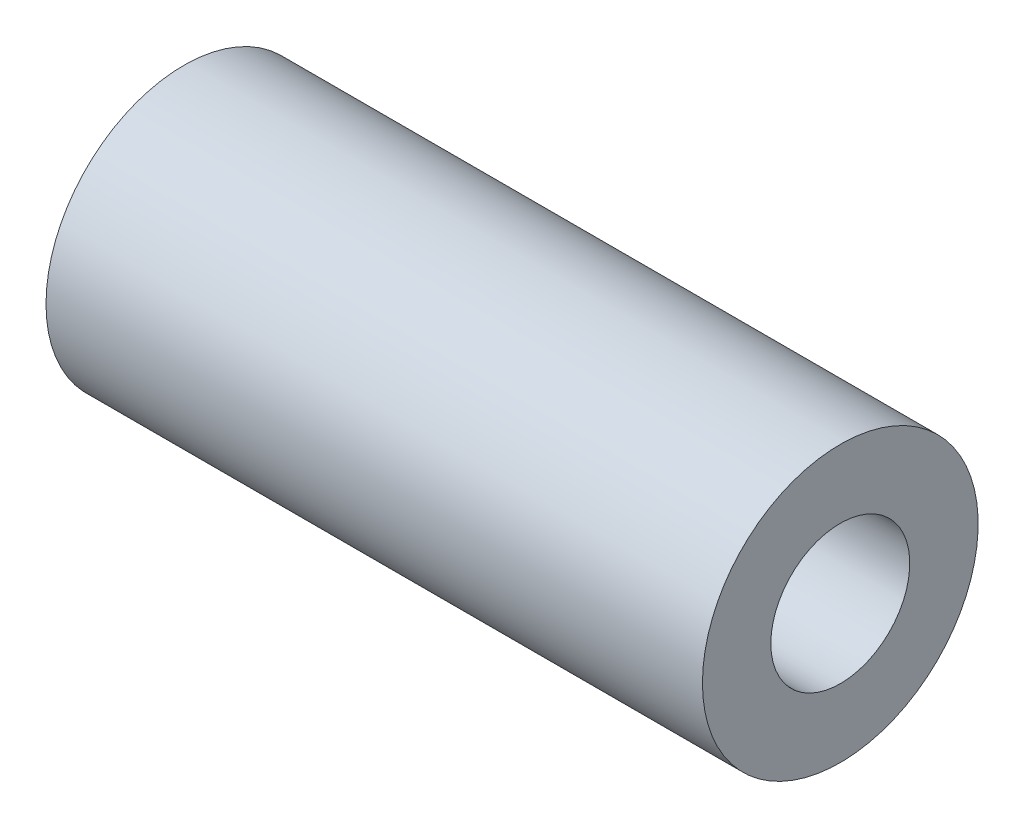
ISO-10303-21;
HEADER;
FILE_DESCRIPTION(('STEP AP214'),'2;1');
FILE_NAME('part.step','',(''),(''),'','','');
FILE_SCHEMA(('AUTOMOTIVE_DESIGN { 1 0 10303 214 1 1 1 1 }'));
ENDSEC;
DATA;
#1=APPLICATION_CONTEXT('core data for automotive mechanical design processes');
#2=APPLICATION_PROTOCOL_DEFINITION('international standard','automotive_design',2000,#1);
#3=PRODUCT_CONTEXT('',#1,'mechanical');
#4=PRODUCT('Part','Part','',(#3));
#5=PRODUCT_RELATED_PRODUCT_CATEGORY('part','',(#4));
#6=PRODUCT_DEFINITION_FORMATION('','',#4);
#7=PRODUCT_DEFINITION_CONTEXT('part definition',#1,'design');
#8=PRODUCT_DEFINITION('design','',#6,#7);
#9=PRODUCT_DEFINITION_SHAPE('','',#8);
#10=(LENGTH_UNIT() NAMED_UNIT(*) SI_UNIT(.MILLI.,.METRE.));
#11=(NAMED_UNIT(*) PLANE_ANGLE_UNIT() SI_UNIT($,.RADIAN.));
#12=(NAMED_UNIT(*) SI_UNIT($,.STERADIAN.) SOLID_ANGLE_UNIT());
#13=UNCERTAINTY_MEASURE_WITH_UNIT(LENGTH_MEASURE(1.E-05),#10,'distance_accuracy_value','');
#14=(GEOMETRIC_REPRESENTATION_CONTEXT(3) GLOBAL_UNCERTAINTY_ASSIGNED_CONTEXT((#13)) GLOBAL_UNIT_ASSIGNED_CONTEXT((#10,
#11,#12)) REPRESENTATION_CONTEXT('',''));
#15=CARTESIAN_POINT('',(0.,0.,0.));
#16=DIRECTION('',(0.,0.,1.));
#17=DIRECTION('',(1.,0.,0.));
#18=AXIS2_PLACEMENT_3D('',#15,#16,#17);
#19=CARTESIAN_POINT('',(-22.5,0.,0.));
#20=DIRECTION('',(1.,0.,0.));
#21=DIRECTION('',(0.,0.,-1.));
#22=AXIS2_PLACEMENT_3D('',#19,#20,#21);
#23=PLANE('',#22);
#24=CARTESIAN_POINT('',(-22.5,0.,0.));
#25=DIRECTION('',(1.,0.,0.));
#26=DIRECTION('',(0.,0.,-1.));
#27=AXIS2_PLACEMENT_3D('',#24,#25,#26);
#28=CIRCLE('',#27,4.7625);
#29=CARTESIAN_POINT('',(-22.5,0.,-4.7625));
#30=VERTEX_POINT('',#29);
#31=EDGE_CURVE('E51',#30,#30,#28,.F.);
#32=ORIENTED_EDGE('',*,*,#31,.F.);
#33=EDGE_LOOP('',(#32));
#34=FACE_BOUND('',#33,.T.);
#35=CARTESIAN_POINT('',(-22.5,0.,0.));
#36=DIRECTION('',(-1.,0.,0.));
#37=DIRECTION('',(0.,0.,1.));
#38=AXIS2_PLACEMENT_3D('',#35,#36,#37);
#39=CIRCLE('',#38,9.45);
#40=CARTESIAN_POINT('',(-22.5,0.,9.45));
#41=VERTEX_POINT('',#40);
#42=EDGE_CURVE('E10',#41,#41,#39,.T.);
#43=ORIENTED_EDGE('',*,*,#42,.T.);
#44=EDGE_LOOP('',(#43));
#45=FACE_BOUND('',#44,.T.);
#46=ADVANCED_FACE('F39',(#34,#45),#23,.F.);
#47=CARTESIAN_POINT('',(-1000.,0.,0.));
#48=DIRECTION('',(-1.,0.,0.));
#49=DIRECTION('',(0.,0.,1.));
#50=AXIS2_PLACEMENT_3D('',#47,#48,#49);
#51=CYLINDRICAL_SURFACE('',#50,9.45);
#52=ORIENTED_EDGE('',*,*,#42,.F.);
#53=EDGE_LOOP('',(#52));
#54=FACE_BOUND('',#53,.T.);
#55=CARTESIAN_POINT('',(22.5,0.,0.));
#56=DIRECTION('',(-1.,0.,0.));
#57=DIRECTION('',(0.,0.,1.));
#58=AXIS2_PLACEMENT_3D('',#55,#56,#57);
#59=CIRCLE('',#58,9.45);
#60=CARTESIAN_POINT('',(22.5,0.,9.45));
#61=VERTEX_POINT('',#60);
#62=EDGE_CURVE('E46',#61,#61,#59,.T.);
#63=ORIENTED_EDGE('',*,*,#62,.T.);
#64=EDGE_LOOP('',(#63));
#65=FACE_BOUND('',#64,.T.);
#66=ADVANCED_FACE('F76',(#54,#65),#51,.T.);
#67=CARTESIAN_POINT('',(22.5,9.45,0.));
#68=DIRECTION('',(-1.,0.,0.));
#69=DIRECTION('',(0.,0.,1.));
#70=AXIS2_PLACEMENT_3D('',#67,#68,#69);
#71=PLANE('',#70);
#72=CARTESIAN_POINT('',(22.5,0.,0.));
#73=DIRECTION('',(-1.,0.,0.));
#74=DIRECTION('',(0.,0.,1.));
#75=AXIS2_PLACEMENT_3D('',#72,#73,#74);
#76=CIRCLE('',#75,4.7625);
#77=CARTESIAN_POINT('',(22.5,0.,4.7625));
#78=VERTEX_POINT('',#77);
#79=EDGE_CURVE('E45',#78,#78,#76,.F.);
#80=ORIENTED_EDGE('',*,*,#79,.F.);
#81=EDGE_LOOP('',(#80));
#82=FACE_BOUND('',#81,.T.);
#83=ORIENTED_EDGE('',*,*,#62,.F.);
#84=EDGE_LOOP('',(#83));
#85=FACE_BOUND('',#84,.T.);
#86=ADVANCED_FACE('F88',(#82,#85),#71,.F.);
#87=CARTESIAN_POINT('',(-1000.,0.,0.));
#88=DIRECTION('',(-1.,0.,0.));
#89=DIRECTION('',(0.,0.,1.));
#90=AXIS2_PLACEMENT_3D('',#87,#88,#89);
#91=CYLINDRICAL_SURFACE('',#90,4.7625);
#92=CARTESIAN_POINT('',(-5.70000000000004,0.,0.));
#93=DIRECTION('',(-1.,0.,0.));
#94=DIRECTION('',(0.,0.,1.));
#95=AXIS2_PLACEMENT_3D('',#92,#93,#94);
#96=CIRCLE('',#95,4.7625);
#97=CARTESIAN_POINT('',(-5.70000000000004,0.,4.7625));
#98=VERTEX_POINT('',#97);
#99=EDGE_CURVE('E54',#98,#98,#96,.T.);
#100=ORIENTED_EDGE('',*,*,#99,.F.);
#101=EDGE_LOOP('',(#100));
#102=FACE_BOUND('',#101,.T.);
#103=ORIENTED_EDGE('',*,*,#31,.T.);
#104=EDGE_LOOP('',(#103));
#105=FACE_BOUND('',#104,.T.);
#106=ADVANCED_FACE('F93',(#102,#105),#91,.F.);
#107=CARTESIAN_POINT('',(-5.7,4.7625,0.));
#108=DIRECTION('',(-1.,0.,0.));
#109=DIRECTION('',(0.,0.,1.));
#110=AXIS2_PLACEMENT_3D('',#107,#108,#109);
#111=PLANE('',#110);
#112=ORIENTED_EDGE('',*,*,#99,.T.);
#113=EDGE_LOOP('',(#112));
#114=FACE_BOUND('',#113,.T.);
#115=ADVANCED_FACE('F78',(#114),#111,.T.);
#116=CARTESIAN_POINT('',(-1000.,0.,0.));
#117=DIRECTION('',(-1.,0.,0.));
#118=DIRECTION('',(0.,0.,1.));
#119=AXIS2_PLACEMENT_3D('',#116,#117,#118);
#120=CYLINDRICAL_SURFACE('',#119,4.7625);
#121=CARTESIAN_POINT('',(5.70000000000004,0.,0.));
#122=DIRECTION('',(-1.,0.,0.));
#123=DIRECTION('',(0.,0.,1.));
#124=AXIS2_PLACEMENT_3D('',#121,#122,#123);
#125=CIRCLE('',#124,4.7625);
#126=CARTESIAN_POINT('',(5.70000000000004,0.,4.7625));
#127=VERTEX_POINT('',#126);
#128=EDGE_CURVE('E64',#127,#127,#125,.T.);
#129=ORIENTED_EDGE('',*,*,#128,.T.);
#130=EDGE_LOOP('',(#129));
#131=FACE_BOUND('',#130,.T.);
#132=ORIENTED_EDGE('',*,*,#79,.T.);
#133=EDGE_LOOP('',(#132));
#134=FACE_BOUND('',#133,.T.);
#135=ADVANCED_FACE('F70',(#131,#134),#120,.F.);
#136=CARTESIAN_POINT('',(5.7,0.,0.));
#137=DIRECTION('',(1.,0.,0.));
#138=DIRECTION('',(0.,0.,-1.));
#139=AXIS2_PLACEMENT_3D('',#136,#137,#138);
#140=PLANE('',#139);
#141=ORIENTED_EDGE('',*,*,#128,.F.);
#142=EDGE_LOOP('',(#141));
#143=FACE_BOUND('',#142,.T.);
#144=ADVANCED_FACE('F68',(#143),#140,.T.);
#145=CLOSED_SHELL('',(#46,#66,#86,#106,#115,#135,#144));
#146=MANIFOLD_SOLID_BREP('B2',#145);
#147=ADVANCED_BREP_SHAPE_REPRESENTATION('',(#18,#146),#14);
#148=SHAPE_DEFINITION_REPRESENTATION(#9,#147);
ENDSEC;
END-ISO-10303-21;
